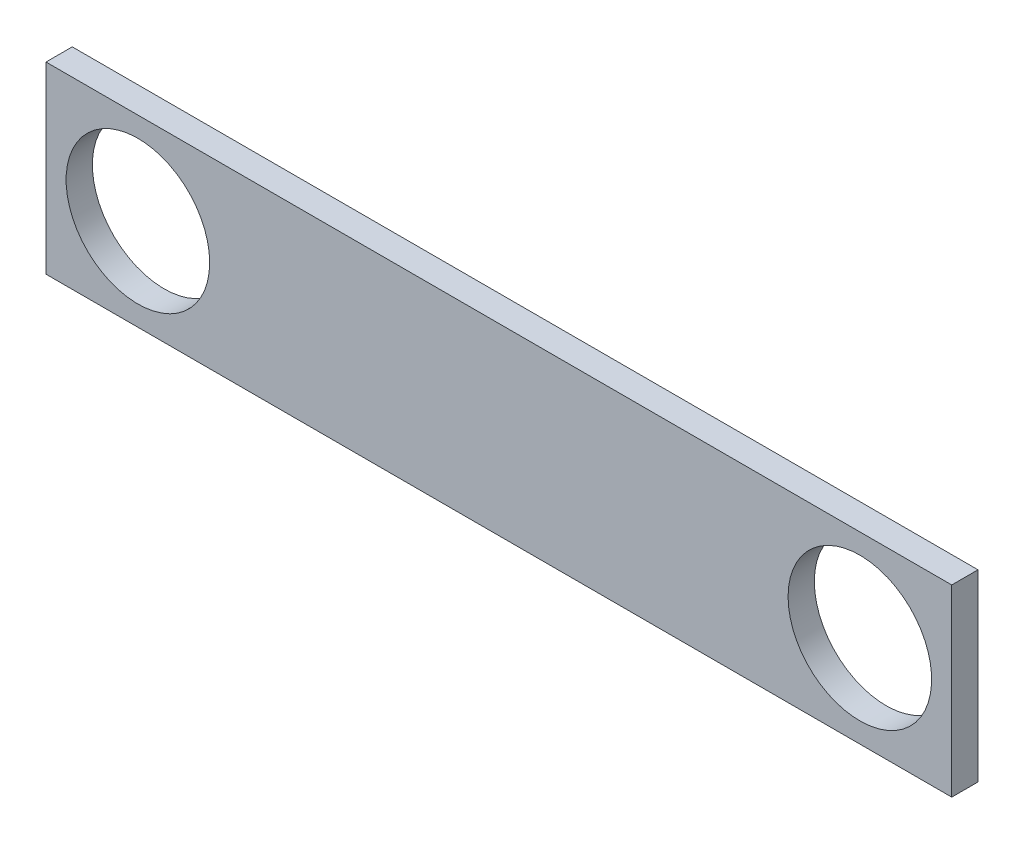
ISO-10303-21;
HEADER;
FILE_DESCRIPTION(('STEP AP214'),'2;1');
FILE_NAME('part.step','',(''),(''),'','','');
FILE_SCHEMA(('AUTOMOTIVE_DESIGN { 1 0 10303 214 1 1 1 1 }'));
ENDSEC;
DATA;
#1=APPLICATION_CONTEXT('core data for automotive mechanical design processes');
#2=APPLICATION_PROTOCOL_DEFINITION('international standard','automotive_design',2000,#1);
#3=PRODUCT_CONTEXT('',#1,'mechanical');
#4=PRODUCT('Part','Part','',(#3));
#5=PRODUCT_RELATED_PRODUCT_CATEGORY('part','',(#4));
#6=PRODUCT_DEFINITION_FORMATION('','',#4);
#7=PRODUCT_DEFINITION_CONTEXT('part definition',#1,'design');
#8=PRODUCT_DEFINITION('design','',#6,#7);
#9=PRODUCT_DEFINITION_SHAPE('','',#8);
#10=(LENGTH_UNIT() NAMED_UNIT(*) SI_UNIT(.MILLI.,.METRE.));
#11=(NAMED_UNIT(*) PLANE_ANGLE_UNIT() SI_UNIT($,.RADIAN.));
#12=(NAMED_UNIT(*) SI_UNIT($,.STERADIAN.) SOLID_ANGLE_UNIT());
#13=UNCERTAINTY_MEASURE_WITH_UNIT(LENGTH_MEASURE(1.E-05),#10,'distance_accuracy_value','');
#14=(GEOMETRIC_REPRESENTATION_CONTEXT(3) GLOBAL_UNCERTAINTY_ASSIGNED_CONTEXT((#13)) GLOBAL_UNIT_ASSIGNED_CONTEXT((#10,
#11,#12)) REPRESENTATION_CONTEXT('',''));
#15=CARTESIAN_POINT('',(0.,0.,0.));
#16=DIRECTION('',(0.,0.,1.));
#17=DIRECTION('',(1.,0.,0.));
#18=AXIS2_PLACEMENT_3D('',#15,#16,#17);
#19=CARTESIAN_POINT('',(0.,0.,2.));
#20=DIRECTION('',(0.,0.,-1.));
#21=DIRECTION('',(-1.,0.,0.));
#22=AXIS2_PLACEMENT_3D('',#19,#20,#21);
#23=PLANE('',#22);
#24=CARTESIAN_POINT('',(-27.5,0.,2.));
#25=DIRECTION('',(0.,0.,1.));
#26=DIRECTION('',(1.,0.,0.));
#27=AXIS2_PLACEMENT_3D('',#24,#25,#26);
#28=CIRCLE('',#27,5.46828662047331);
#29=CARTESIAN_POINT('',(-22.0317133795267,0.,2.));
#30=VERTEX_POINT('',#29);
#31=EDGE_CURVE('E100',#30,#30,#28,.T.);
#32=ORIENTED_EDGE('',*,*,#31,.F.);
#33=EDGE_LOOP('',(#32));
#34=FACE_BOUND('',#33,.T.);
#35=DIRECTION('',(0.,1.,0.));
#36=VECTOR('',#35,1.);
#37=CARTESIAN_POINT('',(34.5,-7.,2.));
#38=LINE('',#37,#36);
#39=CARTESIAN_POINT('',(34.5,-7.,2.));
#40=VERTEX_POINT('',#39);
#41=CARTESIAN_POINT('',(34.5,7.,2.));
#42=VERTEX_POINT('',#41);
#43=EDGE_CURVE('E85',#40,#42,#38,.T.);
#44=ORIENTED_EDGE('',*,*,#43,.T.);
#45=DIRECTION('',(-1.,0.,0.));
#46=VECTOR('',#45,1.);
#47=CARTESIAN_POINT('',(-34.5,7.,2.));
#48=LINE('',#47,#46);
#49=CARTESIAN_POINT('',(-34.5,7.,2.));
#50=VERTEX_POINT('',#49);
#51=EDGE_CURVE('E80',#42,#50,#48,.T.);
#52=ORIENTED_EDGE('',*,*,#51,.T.);
#53=DIRECTION('',(0.,-1.,0.));
#54=VECTOR('',#53,1.);
#55=CARTESIAN_POINT('',(-34.5,-7.,2.));
#56=LINE('',#55,#54);
#57=CARTESIAN_POINT('',(-34.5,-7.,2.));
#58=VERTEX_POINT('',#57);
#59=EDGE_CURVE('E83',#50,#58,#56,.T.);
#60=ORIENTED_EDGE('',*,*,#59,.T.);
#61=DIRECTION('',(1.,0.,0.));
#62=VECTOR('',#61,1.);
#63=CARTESIAN_POINT('',(-34.5,-7.,2.));
#64=LINE('',#63,#62);
#65=EDGE_CURVE('E50',#58,#40,#64,.T.);
#66=ORIENTED_EDGE('',*,*,#65,.T.);
#67=EDGE_LOOP('',(#44,#52,#60,#66));
#68=FACE_BOUND('',#67,.T.);
#69=CARTESIAN_POINT('',(27.5,0.,2.));
#70=DIRECTION('',(0.,0.,1.));
#71=DIRECTION('',(-1.,0.,0.));
#72=AXIS2_PLACEMENT_3D('',#69,#70,#71);
#73=CIRCLE('',#72,5.46828662047331);
#74=CARTESIAN_POINT('',(22.0317133795267,0.,2.));
#75=VERTEX_POINT('',#74);
#76=EDGE_CURVE('E115',#75,#75,#73,.T.);
#77=ORIENTED_EDGE('',*,*,#76,.F.);
#78=EDGE_LOOP('',(#77));
#79=FACE_BOUND('',#78,.T.);
#80=ADVANCED_FACE('F33',(#34,#68,#79),#23,.F.);
#81=CARTESIAN_POINT('',(0.,0.,0.));
#82=DIRECTION('',(0.,0.,-1.));
#83=DIRECTION('',(-1.,0.,0.));
#84=AXIS2_PLACEMENT_3D('',#81,#82,#83);
#85=PLANE('',#84);
#86=CARTESIAN_POINT('',(-27.5,0.,0.));
#87=DIRECTION('',(0.,0.,1.));
#88=DIRECTION('',(1.,0.,0.));
#89=AXIS2_PLACEMENT_3D('',#86,#87,#88);
#90=CIRCLE('',#89,5.46828662047331);
#91=CARTESIAN_POINT('',(-22.0317133795267,0.,0.));
#92=VERTEX_POINT('',#91);
#93=EDGE_CURVE('E112',#92,#92,#90,.T.);
#94=ORIENTED_EDGE('',*,*,#93,.T.);
#95=EDGE_LOOP('',(#94));
#96=FACE_BOUND('',#95,.T.);
#97=DIRECTION('',(0.,1.,0.));
#98=VECTOR('',#97,1.);
#99=CARTESIAN_POINT('',(34.5,-7.,0.));
#100=LINE('',#99,#98);
#101=CARTESIAN_POINT('',(34.5,-7.,0.));
#102=VERTEX_POINT('',#101);
#103=CARTESIAN_POINT('',(34.5,7.,0.));
#104=VERTEX_POINT('',#103);
#105=EDGE_CURVE('E97',#102,#104,#100,.T.);
#106=ORIENTED_EDGE('',*,*,#105,.F.);
#107=DIRECTION('',(1.,0.,0.));
#108=VECTOR('',#107,1.);
#109=CARTESIAN_POINT('',(-34.5,-7.,0.));
#110=LINE('',#109,#108);
#111=CARTESIAN_POINT('',(-34.5,-7.,0.));
#112=VERTEX_POINT('',#111);
#113=EDGE_CURVE('E73',#112,#102,#110,.T.);
#114=ORIENTED_EDGE('',*,*,#113,.F.);
#115=DIRECTION('',(0.,-1.,0.));
#116=VECTOR('',#115,1.);
#117=CARTESIAN_POINT('',(-34.5,-7.,0.));
#118=LINE('',#117,#116);
#119=CARTESIAN_POINT('',(-34.5,7.,0.));
#120=VERTEX_POINT('',#119);
#121=EDGE_CURVE('E67',#120,#112,#118,.T.);
#122=ORIENTED_EDGE('',*,*,#121,.F.);
#123=DIRECTION('',(-1.,0.,0.));
#124=VECTOR('',#123,1.);
#125=CARTESIAN_POINT('',(-34.5,7.,0.));
#126=LINE('',#125,#124);
#127=EDGE_CURVE('E89',#104,#120,#126,.T.);
#128=ORIENTED_EDGE('',*,*,#127,.F.);
#129=EDGE_LOOP('',(#106,#114,#122,#128));
#130=FACE_BOUND('',#129,.T.);
#131=CARTESIAN_POINT('',(27.5,0.,0.));
#132=DIRECTION('',(0.,0.,1.));
#133=DIRECTION('',(-1.,0.,0.));
#134=AXIS2_PLACEMENT_3D('',#131,#132,#133);
#135=CIRCLE('',#134,5.46828662047331);
#136=CARTESIAN_POINT('',(22.0317133795267,0.,0.));
#137=VERTEX_POINT('',#136);
#138=EDGE_CURVE('E118',#137,#137,#135,.T.);
#139=ORIENTED_EDGE('',*,*,#138,.T.);
#140=EDGE_LOOP('',(#139));
#141=FACE_BOUND('',#140,.T.);
#142=ADVANCED_FACE('F108',(#96,#130,#141),#85,.T.);
#143=CARTESIAN_POINT('',(34.5,-7.,2.));
#144=DIRECTION('',(-1.,0.,0.));
#145=DIRECTION('',(0.,0.,1.));
#146=AXIS2_PLACEMENT_3D('',#143,#144,#145);
#147=PLANE('',#146);
#148=ORIENTED_EDGE('',*,*,#105,.T.);
#149=DIRECTION('',(0.,0.,-1.));
#150=VECTOR('',#149,1.);
#151=CARTESIAN_POINT('',(34.5,7.,2.));
#152=LINE('',#151,#150);
#153=EDGE_CURVE('E11',#42,#104,#152,.T.);
#154=ORIENTED_EDGE('',*,*,#153,.F.);
#155=ORIENTED_EDGE('',*,*,#43,.F.);
#156=DIRECTION('',(0.,0.,-1.));
#157=VECTOR('',#156,1.);
#158=CARTESIAN_POINT('',(34.5,-7.,2.));
#159=LINE('',#158,#157);
#160=EDGE_CURVE('E93',#40,#102,#159,.T.);
#161=ORIENTED_EDGE('',*,*,#160,.T.);
#162=EDGE_LOOP('',(#148,#154,#155,#161));
#163=FACE_BOUND('',#162,.T.);
#164=ADVANCED_FACE('F35',(#163),#147,.F.);
#165=CARTESIAN_POINT('',(-34.5,7.,2.));
#166=DIRECTION('',(0.,-1.,0.));
#167=DIRECTION('',(0.,0.,-1.));
#168=AXIS2_PLACEMENT_3D('',#165,#166,#167);
#169=PLANE('',#168);
#170=ORIENTED_EDGE('',*,*,#127,.T.);
#171=DIRECTION('',(0.,0.,-1.));
#172=VECTOR('',#171,1.);
#173=CARTESIAN_POINT('',(-34.5,7.,2.));
#174=LINE('',#173,#172);
#175=EDGE_CURVE('E42',#50,#120,#174,.T.);
#176=ORIENTED_EDGE('',*,*,#175,.F.);
#177=ORIENTED_EDGE('',*,*,#51,.F.);
#178=ORIENTED_EDGE('',*,*,#153,.T.);
#179=EDGE_LOOP('',(#170,#176,#177,#178));
#180=FACE_BOUND('',#179,.T.);
#181=ADVANCED_FACE('F88',(#180),#169,.F.);
#182=CARTESIAN_POINT('',(-34.5,-7.,2.));
#183=DIRECTION('',(1.,0.,0.));
#184=DIRECTION('',(0.,0.,-1.));
#185=AXIS2_PLACEMENT_3D('',#182,#183,#184);
#186=PLANE('',#185);
#187=ORIENTED_EDGE('',*,*,#121,.T.);
#188=DIRECTION('',(0.,0.,-1.));
#189=VECTOR('',#188,1.);
#190=CARTESIAN_POINT('',(-34.5,-7.,2.));
#191=LINE('',#190,#189);
#192=EDGE_CURVE('E90',#58,#112,#191,.T.);
#193=ORIENTED_EDGE('',*,*,#192,.F.);
#194=ORIENTED_EDGE('',*,*,#59,.F.);
#195=ORIENTED_EDGE('',*,*,#175,.T.);
#196=EDGE_LOOP('',(#187,#193,#194,#195));
#197=FACE_BOUND('',#196,.T.);
#198=ADVANCED_FACE('F91',(#197),#186,.F.);
#199=CARTESIAN_POINT('',(-34.5,-7.,2.));
#200=DIRECTION('',(0.,1.,0.));
#201=DIRECTION('',(0.,0.,1.));
#202=AXIS2_PLACEMENT_3D('',#199,#200,#201);
#203=PLANE('',#202);
#204=ORIENTED_EDGE('',*,*,#113,.T.);
#205=ORIENTED_EDGE('',*,*,#160,.F.);
#206=ORIENTED_EDGE('',*,*,#65,.F.);
#207=ORIENTED_EDGE('',*,*,#192,.T.);
#208=EDGE_LOOP('',(#204,#205,#206,#207));
#209=FACE_BOUND('',#208,.T.);
#210=ADVANCED_FACE('F105',(#209),#203,.F.);
#211=CARTESIAN_POINT('',(-27.5,0.,2.));
#212=DIRECTION('',(0.,0.,-1.));
#213=DIRECTION('',(-1.,0.,0.));
#214=AXIS2_PLACEMENT_3D('',#211,#212,#213);
#215=CYLINDRICAL_SURFACE('',#214,5.46828662047331);
#216=ORIENTED_EDGE('',*,*,#31,.T.);
#217=EDGE_LOOP('',(#216));
#218=FACE_BOUND('',#217,.T.);
#219=ORIENTED_EDGE('',*,*,#93,.F.);
#220=EDGE_LOOP('',(#219));
#221=FACE_BOUND('',#220,.T.);
#222=ADVANCED_FACE('F136',(#218,#221),#215,.F.);
#223=CARTESIAN_POINT('',(27.5,0.,2.));
#224=DIRECTION('',(0.,0.,-1.));
#225=DIRECTION('',(-1.,0.,0.));
#226=AXIS2_PLACEMENT_3D('',#223,#224,#225);
#227=CYLINDRICAL_SURFACE('',#226,5.46828662047331);
#228=ORIENTED_EDGE('',*,*,#76,.T.);
#229=EDGE_LOOP('',(#228));
#230=FACE_BOUND('',#229,.T.);
#231=ORIENTED_EDGE('',*,*,#138,.F.);
#232=EDGE_LOOP('',(#231));
#233=FACE_BOUND('',#232,.T.);
#234=ADVANCED_FACE('F124',(#230,#233),#227,.F.);
#235=CLOSED_SHELL('',(#80,#142,#164,#181,#198,#210,#222,#234));
#236=MANIFOLD_SOLID_BREP('B2',#235);
#237=ADVANCED_BREP_SHAPE_REPRESENTATION('',(#18,#236),#14);
#238=SHAPE_DEFINITION_REPRESENTATION(#9,#237);
ENDSEC;
END-ISO-10303-21;
